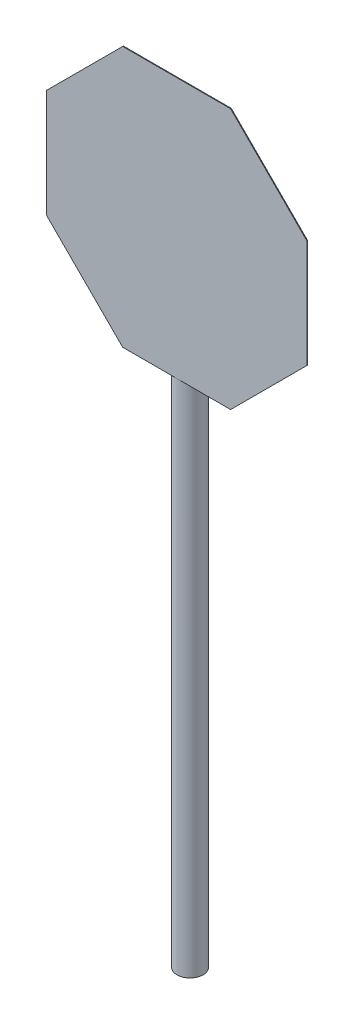
ISO-10303-21;
HEADER;
FILE_DESCRIPTION(('STEP AP214'),'2;1');
FILE_NAME('part.step','',(''),(''),'','','');
FILE_SCHEMA(('AUTOMOTIVE_DESIGN { 1 0 10303 214 1 1 1 1 }'));
ENDSEC;
DATA;
#1=APPLICATION_CONTEXT('core data for automotive mechanical design processes');
#2=APPLICATION_PROTOCOL_DEFINITION('international standard','automotive_design',2000,#1);
#3=PRODUCT_CONTEXT('',#1,'mechanical');
#4=PRODUCT('Part','Part','',(#3));
#5=PRODUCT_RELATED_PRODUCT_CATEGORY('part','',(#4));
#6=PRODUCT_DEFINITION_FORMATION('','',#4);
#7=PRODUCT_DEFINITION_CONTEXT('part definition',#1,'design');
#8=PRODUCT_DEFINITION('design','',#6,#7);
#9=PRODUCT_DEFINITION_SHAPE('','',#8);
#10=(LENGTH_UNIT() NAMED_UNIT(*) SI_UNIT(.MILLI.,.METRE.));
#11=(NAMED_UNIT(*) PLANE_ANGLE_UNIT() SI_UNIT($,.RADIAN.));
#12=(NAMED_UNIT(*) SI_UNIT($,.STERADIAN.) SOLID_ANGLE_UNIT());
#13=UNCERTAINTY_MEASURE_WITH_UNIT(LENGTH_MEASURE(1.E-05),#10,'distance_accuracy_value','');
#14=(GEOMETRIC_REPRESENTATION_CONTEXT(3) GLOBAL_UNCERTAINTY_ASSIGNED_CONTEXT((#13)) GLOBAL_UNIT_ASSIGNED_CONTEXT((#10,
#11,#12)) REPRESENTATION_CONTEXT('',''));
#15=CARTESIAN_POINT('',(0.,0.,0.));
#16=DIRECTION('',(0.,0.,1.));
#17=DIRECTION('',(1.,0.,0.));
#18=AXIS2_PLACEMENT_3D('',#15,#16,#17);
#19=CARTESIAN_POINT('',(0.,2133.6,0.));
#20=DIRECTION('',(0.,-1.,0.));
#21=DIRECTION('',(0.,0.,-1.));
#22=AXIS2_PLACEMENT_3D('',#19,#20,#21);
#23=CYLINDRICAL_SURFACE('',#22,38.1);
#24=CARTESIAN_POINT('',(0.,0.,0.));
#25=DIRECTION('',(0.,1.,0.));
#26=DIRECTION('',(0.,0.,1.));
#27=AXIS2_PLACEMENT_3D('',#24,#25,#26);
#28=CIRCLE('',#27,38.1);
#29=CARTESIAN_POINT('',(0.,0.,38.1));
#30=VERTEX_POINT('',#29);
#31=EDGE_CURVE('E143',#30,#30,#28,.T.);
#32=ORIENTED_EDGE('',*,*,#31,.T.);
#33=EDGE_LOOP('',(#32));
#34=FACE_BOUND('',#33,.T.);
#35=DIRECTION('',(0.,-1.,0.));
#36=VECTOR('',#35,1.);
#37=CARTESIAN_POINT('',(-8.73996247131532,2133.6,37.084));
#38=LINE('',#37,#36);
#39=CARTESIAN_POINT('',(-8.73996247131532,2133.6,37.084));
#40=VERTEX_POINT('',#39);
#41=CARTESIAN_POINT('',(-8.73996247131531,1511.3,37.084));
#42=VERTEX_POINT('',#41);
#43=EDGE_CURVE('E136',#40,#42,#38,.T.);
#44=ORIENTED_EDGE('',*,*,#43,.F.);
#45=CARTESIAN_POINT('',(0.,2133.6,0.));
#46=DIRECTION('',(0.,1.,0.));
#47=DIRECTION('',(0.,0.,1.));
#48=AXIS2_PLACEMENT_3D('',#45,#46,#47);
#49=CIRCLE('',#48,38.1);
#50=CARTESIAN_POINT('',(8.73996247131532,2133.6,37.084));
#51=VERTEX_POINT('',#50);
#52=EDGE_CURVE('E144',#51,#40,#49,.T.);
#53=ORIENTED_EDGE('',*,*,#52,.F.);
#54=DIRECTION('',(0.,-1.,0.));
#55=VECTOR('',#54,1.);
#56=CARTESIAN_POINT('',(8.73996247131532,2133.6,37.084));
#57=LINE('',#56,#55);
#58=CARTESIAN_POINT('',(8.73996247131531,1511.3,37.084));
#59=VERTEX_POINT('',#58);
#60=EDGE_CURVE('E51',#59,#51,#57,.F.);
#61=ORIENTED_EDGE('',*,*,#60,.F.);
#62=CARTESIAN_POINT('',(0.,1511.3,0.));
#63=DIRECTION('',(0.,1.,0.));
#64=DIRECTION('',(-1.,0.,0.));
#65=AXIS2_PLACEMENT_3D('',#62,#63,#64);
#66=CIRCLE('',#65,38.1);
#67=EDGE_CURVE('E11',#42,#59,#66,.T.);
#68=ORIENTED_EDGE('',*,*,#67,.F.);
#69=EDGE_LOOP('',(#44,#53,#61,#68));
#70=FACE_BOUND('',#69,.T.);
#71=ADVANCED_FACE('F37',(#34,#70),#23,.T.);
#72=CARTESIAN_POINT('',(0.,2133.6,0.));
#73=DIRECTION('',(0.,1.,0.));
#74=DIRECTION('',(0.,0.,1.));
#75=AXIS2_PLACEMENT_3D('',#72,#73,#74);
#76=PLANE('',#75);
#77=ORIENTED_EDGE('',*,*,#52,.T.);
#78=DIRECTION('',(1.,0.,0.));
#79=VECTOR('',#78,1.);
#80=CARTESIAN_POINT('',(0.,2133.6,37.084));
#81=LINE('',#80,#79);
#82=EDGE_CURVE('E44',#40,#51,#81,.T.);
#83=ORIENTED_EDGE('',*,*,#82,.T.);
#84=EDGE_LOOP('',(#77,#83));
#85=FACE_BOUND('',#84,.T.);
#86=ADVANCED_FACE('F150',(#85),#76,.T.);
#87=CARTESIAN_POINT('',(0.,0.,0.));
#88=DIRECTION('',(0.,1.,0.));
#89=DIRECTION('',(0.,0.,1.));
#90=AXIS2_PLACEMENT_3D('',#87,#88,#89);
#91=PLANE('',#90);
#92=ORIENTED_EDGE('',*,*,#31,.F.);
#93=EDGE_LOOP('',(#92));
#94=FACE_BOUND('',#93,.T.);
#95=ADVANCED_FACE('F234',(#94),#91,.F.);
#96=CARTESIAN_POINT('',(0.,0.,37.084));
#97=DIRECTION('',(0.,0.,1.));
#98=DIRECTION('',(1.,0.,0.));
#99=AXIS2_PLACEMENT_3D('',#96,#97,#98);
#100=PLANE('',#99);
#101=ORIENTED_EDGE('',*,*,#82,.F.);
#102=ORIENTED_EDGE('',*,*,#43,.T.);
#103=DIRECTION('',(1.,0.,0.));
#104=VECTOR('',#103,1.);
#105=CARTESIAN_POINT('',(-157.815367264149,1511.3,37.084));
#106=LINE('',#105,#104);
#107=CARTESIAN_POINT('',(-157.815367264149,1511.3,37.084));
#108=VERTEX_POINT('',#107);
#109=EDGE_CURVE('E156',#108,#42,#106,.T.);
#110=ORIENTED_EDGE('',*,*,#109,.F.);
#111=DIRECTION('',(0.707106781186548,-0.707106781186547,0.));
#112=VECTOR('',#111,1.);
#113=CARTESIAN_POINT('',(-381.,1734.48463273585,37.084));
#114=LINE('',#113,#112);
#115=CARTESIAN_POINT('',(-381.,1734.48463273585,37.084));
#116=VERTEX_POINT('',#115);
#117=EDGE_CURVE('E164',#116,#108,#114,.T.);
#118=ORIENTED_EDGE('',*,*,#117,.F.);
#119=DIRECTION('',(0.,-1.,0.));
#120=VECTOR('',#119,1.);
#121=CARTESIAN_POINT('',(-381.,2050.11536726415,37.084));
#122=LINE('',#121,#120);
#123=CARTESIAN_POINT('',(-381.,2050.11536726415,37.084));
#124=VERTEX_POINT('',#123);
#125=EDGE_CURVE('E134',#124,#116,#122,.T.);
#126=ORIENTED_EDGE('',*,*,#125,.F.);
#127=DIRECTION('',(-0.707106781186547,-0.707106781186548,0.));
#128=VECTOR('',#127,1.);
#129=CARTESIAN_POINT('',(-157.81536726415,2273.3,37.084));
#130=LINE('',#129,#128);
#131=CARTESIAN_POINT('',(-157.81536726415,2273.3,37.084));
#132=VERTEX_POINT('',#131);
#133=EDGE_CURVE('E130',#132,#124,#130,.T.);
#134=ORIENTED_EDGE('',*,*,#133,.F.);
#135=DIRECTION('',(-1.,0.,0.));
#136=VECTOR('',#135,1.);
#137=CARTESIAN_POINT('',(157.815367264149,2273.3,37.084));
#138=LINE('',#137,#136);
#139=CARTESIAN_POINT('',(157.815367264149,2273.3,37.084));
#140=VERTEX_POINT('',#139);
#141=EDGE_CURVE('E171',#140,#132,#138,.T.);
#142=ORIENTED_EDGE('',*,*,#141,.F.);
#143=DIRECTION('',(-0.707106781186547,0.707106781186548,0.));
#144=VECTOR('',#143,1.);
#145=CARTESIAN_POINT('',(381.,2050.11536726415,37.084));
#146=LINE('',#145,#144);
#147=CARTESIAN_POINT('',(381.,2050.11536726415,37.084));
#148=VERTEX_POINT('',#147);
#149=EDGE_CURVE('E169',#148,#140,#146,.T.);
#150=ORIENTED_EDGE('',*,*,#149,.F.);
#151=DIRECTION('',(0.,1.,0.));
#152=VECTOR('',#151,1.);
#153=CARTESIAN_POINT('',(381.,1734.48463273585,37.084));
#154=LINE('',#153,#152);
#155=CARTESIAN_POINT('',(381.,1734.48463273585,37.084));
#156=VERTEX_POINT('',#155);
#157=EDGE_CURVE('E162',#156,#148,#154,.T.);
#158=ORIENTED_EDGE('',*,*,#157,.F.);
#159=DIRECTION('',(0.707106781186547,0.707106781186548,0.));
#160=VECTOR('',#159,1.);
#161=CARTESIAN_POINT('',(157.815367264149,1511.3,37.084));
#162=LINE('',#161,#160);
#163=CARTESIAN_POINT('',(157.815367264149,1511.3,37.084));
#164=VERTEX_POINT('',#163);
#165=EDGE_CURVE('E159',#164,#156,#162,.T.);
#166=ORIENTED_EDGE('',*,*,#165,.F.);
#167=EDGE_CURVE('E160',#59,#164,#106,.T.);
#168=ORIENTED_EDGE('',*,*,#167,.F.);
#169=ORIENTED_EDGE('',*,*,#60,.T.);
#170=EDGE_LOOP('',(#101,#102,#110,#118,#126,#134,#142,#150,#158,#166,#168,#169));
#171=FACE_BOUND('',#170,.T.);
#172=ADVANCED_FACE('F155',(#171),#100,.F.);
#173=CARTESIAN_POINT('',(-381.,2050.11536726415,39.116));
#174=DIRECTION('',(1.,0.,0.));
#175=DIRECTION('',(0.,1.,0.));
#176=AXIS2_PLACEMENT_3D('',#173,#174,#175);
#177=PLANE('',#176);
#178=ORIENTED_EDGE('',*,*,#125,.T.);
#179=DIRECTION('',(0.,0.,-1.));
#180=VECTOR('',#179,1.);
#181=CARTESIAN_POINT('',(-381.,1734.48463273585,39.116));
#182=LINE('',#181,#180);
#183=CARTESIAN_POINT('',(-381.,1734.48463273585,39.116));
#184=VERTEX_POINT('',#183);
#185=EDGE_CURVE('E114',#184,#116,#182,.T.);
#186=ORIENTED_EDGE('',*,*,#185,.F.);
#187=DIRECTION('',(0.,-1.,0.));
#188=VECTOR('',#187,1.);
#189=CARTESIAN_POINT('',(-381.,2050.11536726415,39.116));
#190=LINE('',#189,#188);
#191=CARTESIAN_POINT('',(-381.,2050.11536726415,39.116));
#192=VERTEX_POINT('',#191);
#193=EDGE_CURVE('E121',#192,#184,#190,.T.);
#194=ORIENTED_EDGE('',*,*,#193,.F.);
#195=DIRECTION('',(0.,0.,-1.));
#196=VECTOR('',#195,1.);
#197=CARTESIAN_POINT('',(-381.,2050.11536726415,39.116));
#198=LINE('',#197,#196);
#199=EDGE_CURVE('E174',#192,#124,#198,.T.);
#200=ORIENTED_EDGE('',*,*,#199,.T.);
#201=EDGE_LOOP('',(#178,#186,#194,#200));
#202=FACE_BOUND('',#201,.T.);
#203=ADVANCED_FACE('F132',(#202),#177,.F.);
#204=CARTESIAN_POINT('',(-381.,1734.48463273585,39.116));
#205=DIRECTION('',(0.707106781186547,0.707106781186548,0.));
#206=DIRECTION('',(-0.707106781186548,0.707106781186547,0.));
#207=AXIS2_PLACEMENT_3D('',#204,#205,#206);
#208=PLANE('',#207);
#209=ORIENTED_EDGE('',*,*,#117,.T.);
#210=DIRECTION('',(0.,0.,-1.));
#211=VECTOR('',#210,1.);
#212=CARTESIAN_POINT('',(-157.815367264149,1511.3,39.116));
#213=LINE('',#212,#211);
#214=CARTESIAN_POINT('',(-157.815367264149,1511.3,39.116));
#215=VERTEX_POINT('',#214);
#216=EDGE_CURVE('E117',#215,#108,#213,.T.);
#217=ORIENTED_EDGE('',*,*,#216,.F.);
#218=DIRECTION('',(0.707106781186548,-0.707106781186547,0.));
#219=VECTOR('',#218,1.);
#220=CARTESIAN_POINT('',(-381.,1734.48463273585,39.116));
#221=LINE('',#220,#219);
#222=EDGE_CURVE('E110',#184,#215,#221,.T.);
#223=ORIENTED_EDGE('',*,*,#222,.F.);
#224=ORIENTED_EDGE('',*,*,#185,.T.);
#225=EDGE_LOOP('',(#209,#217,#223,#224));
#226=FACE_BOUND('',#225,.T.);
#227=ADVANCED_FACE('F112',(#226),#208,.F.);
#228=CARTESIAN_POINT('',(-157.815367264149,1511.3,39.116));
#229=DIRECTION('',(0.,1.,0.));
#230=DIRECTION('',(-1.,0.,0.));
#231=AXIS2_PLACEMENT_3D('',#228,#229,#230);
#232=PLANE('',#231);
#233=ORIENTED_EDGE('',*,*,#109,.T.);
#234=ORIENTED_EDGE('',*,*,#67,.T.);
#235=ORIENTED_EDGE('',*,*,#167,.T.);
#236=DIRECTION('',(0.,0.,-1.));
#237=VECTOR('',#236,1.);
#238=CARTESIAN_POINT('',(157.815367264149,1511.3,39.116));
#239=LINE('',#238,#237);
#240=CARTESIAN_POINT('',(157.815367264149,1511.3,39.116));
#241=VERTEX_POINT('',#240);
#242=EDGE_CURVE('E138',#241,#164,#239,.T.);
#243=ORIENTED_EDGE('',*,*,#242,.F.);
#244=DIRECTION('',(1.,0.,0.));
#245=VECTOR('',#244,1.);
#246=CARTESIAN_POINT('',(-157.815367264149,1511.3,39.116));
#247=LINE('',#246,#245);
#248=EDGE_CURVE('E120',#215,#241,#247,.T.);
#249=ORIENTED_EDGE('',*,*,#248,.F.);
#250=ORIENTED_EDGE('',*,*,#216,.T.);
#251=EDGE_LOOP('',(#233,#234,#235,#243,#249,#250));
#252=FACE_BOUND('',#251,.T.);
#253=ADVANCED_FACE('F158',(#252),#232,.F.);
#254=CARTESIAN_POINT('',(157.815367264149,1511.3,39.116));
#255=DIRECTION('',(-0.707106781186548,0.707106781186547,0.));
#256=DIRECTION('',(-0.707106781186547,-0.707106781186548,0.));
#257=AXIS2_PLACEMENT_3D('',#254,#255,#256);
#258=PLANE('',#257);
#259=ORIENTED_EDGE('',*,*,#165,.T.);
#260=DIRECTION('',(0.,0.,-1.));
#261=VECTOR('',#260,1.);
#262=CARTESIAN_POINT('',(381.,1734.48463273585,39.116));
#263=LINE('',#262,#261);
#264=CARTESIAN_POINT('',(381.,1734.48463273585,39.116));
#265=VERTEX_POINT('',#264);
#266=EDGE_CURVE('E185',#265,#156,#263,.T.);
#267=ORIENTED_EDGE('',*,*,#266,.F.);
#268=DIRECTION('',(0.707106781186547,0.707106781186548,0.));
#269=VECTOR('',#268,1.);
#270=CARTESIAN_POINT('',(157.815367264149,1511.3,39.116));
#271=LINE('',#270,#269);
#272=EDGE_CURVE('E194',#241,#265,#271,.T.);
#273=ORIENTED_EDGE('',*,*,#272,.F.);
#274=ORIENTED_EDGE('',*,*,#242,.T.);
#275=EDGE_LOOP('',(#259,#267,#273,#274));
#276=FACE_BOUND('',#275,.T.);
#277=ADVANCED_FACE('F192',(#276),#258,.F.);
#278=CARTESIAN_POINT('',(381.,1734.48463273585,39.116));
#279=DIRECTION('',(-1.,0.,0.));
#280=DIRECTION('',(0.,0.,1.));
#281=AXIS2_PLACEMENT_3D('',#278,#279,#280);
#282=PLANE('',#281);
#283=ORIENTED_EDGE('',*,*,#157,.T.);
#284=DIRECTION('',(0.,0.,-1.));
#285=VECTOR('',#284,1.);
#286=CARTESIAN_POINT('',(381.,2050.11536726415,39.116));
#287=LINE('',#286,#285);
#288=CARTESIAN_POINT('',(381.,2050.11536726415,39.116));
#289=VERTEX_POINT('',#288);
#290=EDGE_CURVE('E182',#289,#148,#287,.T.);
#291=ORIENTED_EDGE('',*,*,#290,.F.);
#292=DIRECTION('',(0.,1.,0.));
#293=VECTOR('',#292,1.);
#294=CARTESIAN_POINT('',(381.,1734.48463273585,39.116));
#295=LINE('',#294,#293);
#296=EDGE_CURVE('E209',#265,#289,#295,.T.);
#297=ORIENTED_EDGE('',*,*,#296,.F.);
#298=ORIENTED_EDGE('',*,*,#266,.T.);
#299=EDGE_LOOP('',(#283,#291,#297,#298));
#300=FACE_BOUND('',#299,.T.);
#301=ADVANCED_FACE('F200',(#300),#282,.F.);
#302=CARTESIAN_POINT('',(381.,2050.11536726415,39.116));
#303=DIRECTION('',(-0.707106781186548,-0.707106781186547,0.));
#304=DIRECTION('',(0.707106781186547,-0.707106781186548,0.));
#305=AXIS2_PLACEMENT_3D('',#302,#303,#304);
#306=PLANE('',#305);
#307=ORIENTED_EDGE('',*,*,#149,.T.);
#308=DIRECTION('',(0.,0.,-1.));
#309=VECTOR('',#308,1.);
#310=CARTESIAN_POINT('',(157.815367264149,2273.3,39.116));
#311=LINE('',#310,#309);
#312=CARTESIAN_POINT('',(157.815367264149,2273.3,39.116));
#313=VERTEX_POINT('',#312);
#314=EDGE_CURVE('E179',#313,#140,#311,.T.);
#315=ORIENTED_EDGE('',*,*,#314,.F.);
#316=DIRECTION('',(-0.707106781186547,0.707106781186548,0.));
#317=VECTOR('',#316,1.);
#318=CARTESIAN_POINT('',(381.,2050.11536726415,39.116));
#319=LINE('',#318,#317);
#320=EDGE_CURVE('E206',#289,#313,#319,.T.);
#321=ORIENTED_EDGE('',*,*,#320,.F.);
#322=ORIENTED_EDGE('',*,*,#290,.T.);
#323=EDGE_LOOP('',(#307,#315,#321,#322));
#324=FACE_BOUND('',#323,.T.);
#325=ADVANCED_FACE('F204',(#324),#306,.F.);
#326=CARTESIAN_POINT('',(157.815367264149,2273.3,39.116));
#327=DIRECTION('',(0.,-1.,0.));
#328=DIRECTION('',(0.,0.,-1.));
#329=AXIS2_PLACEMENT_3D('',#326,#327,#328);
#330=PLANE('',#329);
#331=ORIENTED_EDGE('',*,*,#141,.T.);
#332=DIRECTION('',(0.,0.,-1.));
#333=VECTOR('',#332,1.);
#334=CARTESIAN_POINT('',(-157.81536726415,2273.3,39.116));
#335=LINE('',#334,#333);
#336=CARTESIAN_POINT('',(-157.81536726415,2273.3,39.116));
#337=VERTEX_POINT('',#336);
#338=EDGE_CURVE('E176',#337,#132,#335,.T.);
#339=ORIENTED_EDGE('',*,*,#338,.F.);
#340=DIRECTION('',(-1.,0.,0.));
#341=VECTOR('',#340,1.);
#342=CARTESIAN_POINT('',(157.815367264149,2273.3,39.116));
#343=LINE('',#342,#341);
#344=EDGE_CURVE('E208',#313,#337,#343,.T.);
#345=ORIENTED_EDGE('',*,*,#344,.F.);
#346=ORIENTED_EDGE('',*,*,#314,.T.);
#347=EDGE_LOOP('',(#331,#339,#345,#346));
#348=FACE_BOUND('',#347,.T.);
#349=ADVANCED_FACE('F220',(#348),#330,.F.);
#350=CARTESIAN_POINT('',(-157.81536726415,2273.3,39.116));
#351=DIRECTION('',(0.707106781186548,-0.707106781186547,0.));
#352=DIRECTION('',(0.707106781186547,0.707106781186548,0.));
#353=AXIS2_PLACEMENT_3D('',#350,#351,#352);
#354=PLANE('',#353);
#355=ORIENTED_EDGE('',*,*,#133,.T.);
#356=ORIENTED_EDGE('',*,*,#199,.F.);
#357=DIRECTION('',(-0.707106781186547,-0.707106781186548,0.));
#358=VECTOR('',#357,1.);
#359=CARTESIAN_POINT('',(-157.81536726415,2273.3,39.116));
#360=LINE('',#359,#358);
#361=EDGE_CURVE('E126',#337,#192,#360,.T.);
#362=ORIENTED_EDGE('',*,*,#361,.F.);
#363=ORIENTED_EDGE('',*,*,#338,.T.);
#364=EDGE_LOOP('',(#355,#356,#362,#363));
#365=FACE_BOUND('',#364,.T.);
#366=ADVANCED_FACE('F217',(#365),#354,.F.);
#367=CARTESIAN_POINT('',(0.,0.,39.116));
#368=DIRECTION('',(0.,0.,1.));
#369=DIRECTION('',(1.,0.,0.));
#370=AXIS2_PLACEMENT_3D('',#367,#368,#369);
#371=PLANE('',#370);
#372=ORIENTED_EDGE('',*,*,#193,.T.);
#373=ORIENTED_EDGE('',*,*,#222,.T.);
#374=ORIENTED_EDGE('',*,*,#248,.T.);
#375=ORIENTED_EDGE('',*,*,#272,.T.);
#376=ORIENTED_EDGE('',*,*,#296,.T.);
#377=ORIENTED_EDGE('',*,*,#320,.T.);
#378=ORIENTED_EDGE('',*,*,#344,.T.);
#379=ORIENTED_EDGE('',*,*,#361,.T.);
#380=EDGE_LOOP('',(#372,#373,#374,#375,#376,#377,#378,#379));
#381=FACE_BOUND('',#380,.T.);
#382=ADVANCED_FACE('F124',(#381),#371,.T.);
#383=CLOSED_SHELL('',(#71,#86,#95,#172,#203,#227,#253,#277,#301,#325,#349,#366,#382));
#384=MANIFOLD_SOLID_BREP('B2',#383);
#385=ADVANCED_BREP_SHAPE_REPRESENTATION('',(#18,#384),#14);
#386=SHAPE_DEFINITION_REPRESENTATION(#9,#385);
ENDSEC;
END-ISO-10303-21;
